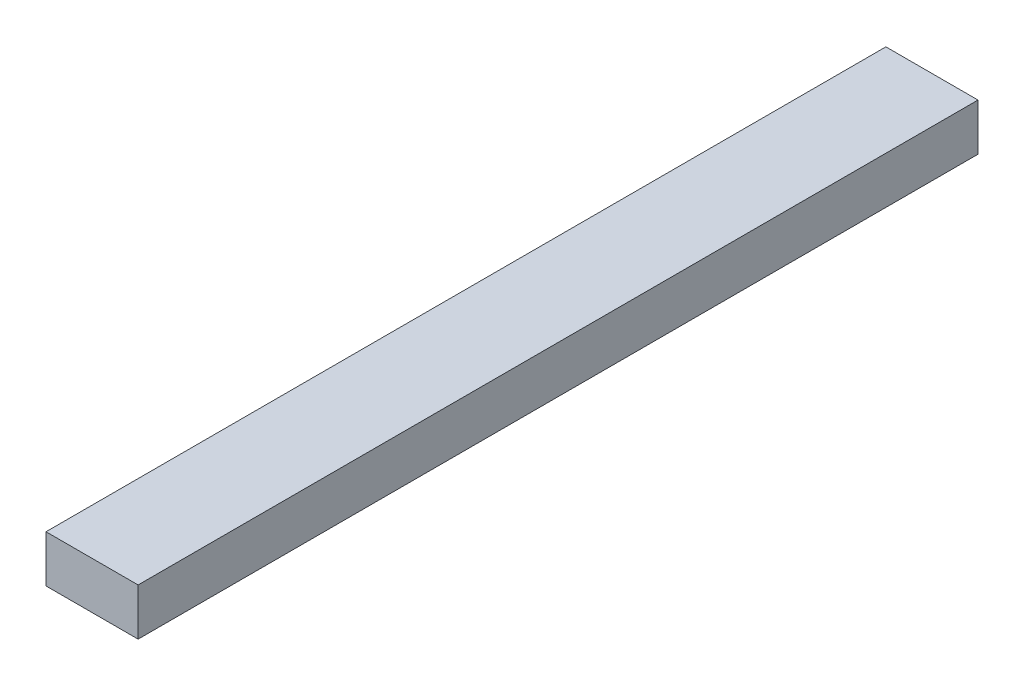
ISO-10303-21;
HEADER;
FILE_DESCRIPTION(('STEP AP214'),'2;1');
FILE_NAME('part.step','',(''),(''),'','','');
FILE_SCHEMA(('AUTOMOTIVE_DESIGN { 1 0 10303 214 1 1 1 1 }'));
ENDSEC;
DATA;
#1=APPLICATION_CONTEXT('core data for automotive mechanical design processes');
#2=APPLICATION_PROTOCOL_DEFINITION('international standard','automotive_design',2000,#1);
#3=PRODUCT_CONTEXT('',#1,'mechanical');
#4=PRODUCT('Part','Part','',(#3));
#5=PRODUCT_RELATED_PRODUCT_CATEGORY('part','',(#4));
#6=PRODUCT_DEFINITION_FORMATION('','',#4);
#7=PRODUCT_DEFINITION_CONTEXT('part definition',#1,'design');
#8=PRODUCT_DEFINITION('design','',#6,#7);
#9=PRODUCT_DEFINITION_SHAPE('','',#8);
#10=(LENGTH_UNIT() NAMED_UNIT(*) SI_UNIT(.MILLI.,.METRE.));
#11=(NAMED_UNIT(*) PLANE_ANGLE_UNIT() SI_UNIT($,.RADIAN.));
#12=(NAMED_UNIT(*) SI_UNIT($,.STERADIAN.) SOLID_ANGLE_UNIT());
#13=UNCERTAINTY_MEASURE_WITH_UNIT(LENGTH_MEASURE(1.E-05),#10,'distance_accuracy_value','');
#14=(GEOMETRIC_REPRESENTATION_CONTEXT(3) GLOBAL_UNCERTAINTY_ASSIGNED_CONTEXT((#13)) GLOBAL_UNIT_ASSIGNED_CONTEXT((#10,
#11,#12)) REPRESENTATION_CONTEXT('',''));
#15=CARTESIAN_POINT('',(0.,0.,0.));
#16=DIRECTION('',(0.,0.,1.));
#17=DIRECTION('',(1.,0.,0.));
#18=AXIS2_PLACEMENT_3D('',#15,#16,#17);
#19=CARTESIAN_POINT('',(-84.1621804374241,15.9452575941677,-234.95));
#20=DIRECTION('',(1.,0.,0.));
#21=DIRECTION('',(0.,0.,-1.));
#22=AXIS2_PLACEMENT_3D('',#19,#20,#21);
#23=PLANE('',#22);
#24=DIRECTION('',(0.,1.,0.));
#25=VECTOR('',#24,1.);
#26=CARTESIAN_POINT('',(-84.1621804374241,15.9452575941677,0.));
#27=LINE('',#26,#25);
#28=CARTESIAN_POINT('',(-84.1621804374241,15.9452575941677,0.));
#29=VERTEX_POINT('',#28);
#30=CARTESIAN_POINT('',(-84.1621804374241,19.2472575941677,0.));
#31=VERTEX_POINT('',#30);
#32=EDGE_CURVE('E58',#29,#31,#27,.T.);
#33=ORIENTED_EDGE('',*,*,#32,.F.);
#34=DIRECTION('',(0.,0.,1.));
#35=VECTOR('',#34,1.);
#36=CARTESIAN_POINT('',(-84.1621804374241,15.9452575941677,-234.95));
#37=LINE('',#36,#35);
#38=CARTESIAN_POINT('',(-84.1621804374241,15.9452575941677,-59.055));
#39=VERTEX_POINT('',#38);
#40=EDGE_CURVE('E33',#39,#29,#37,.T.);
#41=ORIENTED_EDGE('',*,*,#40,.F.);
#42=DIRECTION('',(0.,1.,0.));
#43=VECTOR('',#42,1.);
#44=CARTESIAN_POINT('',(-84.1621804374241,15.9452575941677,-59.055));
#45=LINE('',#44,#43);
#46=CARTESIAN_POINT('',(-84.1621804374241,19.2472575941677,-59.055));
#47=VERTEX_POINT('',#46);
#48=EDGE_CURVE('E60',#39,#47,#45,.T.);
#49=ORIENTED_EDGE('',*,*,#48,.T.);
#50=DIRECTION('',(0.,0.,1.));
#51=VECTOR('',#50,1.);
#52=CARTESIAN_POINT('',(-84.1621804374241,19.2472575941677,-234.95));
#53=LINE('',#52,#51);
#54=EDGE_CURVE('E10',#47,#31,#53,.T.);
#55=ORIENTED_EDGE('',*,*,#54,.T.);
#56=EDGE_LOOP('',(#33,#41,#49,#55));
#57=FACE_BOUND('',#56,.T.);
#58=ADVANCED_FACE('F16',(#57),#23,.T.);
#59=CARTESIAN_POINT('',(-84.1621804374241,19.2472575941677,-234.95));
#60=DIRECTION('',(0.,1.,0.));
#61=DIRECTION('',(0.,0.,1.));
#62=AXIS2_PLACEMENT_3D('',#59,#60,#61);
#63=PLANE('',#62);
#64=DIRECTION('',(-1.,0.,0.));
#65=VECTOR('',#64,1.);
#66=CARTESIAN_POINT('',(-84.1621804374241,19.2472575941677,0.));
#67=LINE('',#66,#65);
#68=CARTESIAN_POINT('',(-90.6391804374241,19.2472575941677,0.));
#69=VERTEX_POINT('',#68);
#70=EDGE_CURVE('E65',#31,#69,#67,.T.);
#71=ORIENTED_EDGE('',*,*,#70,.F.);
#72=ORIENTED_EDGE('',*,*,#54,.F.);
#73=DIRECTION('',(-1.,0.,0.));
#74=VECTOR('',#73,1.);
#75=CARTESIAN_POINT('',(-84.1621804374241,19.2472575941677,-59.055));
#76=LINE('',#75,#74);
#77=CARTESIAN_POINT('',(-90.6391804374241,19.2472575941677,-59.055));
#78=VERTEX_POINT('',#77);
#79=EDGE_CURVE('E87',#47,#78,#76,.T.);
#80=ORIENTED_EDGE('',*,*,#79,.T.);
#81=DIRECTION('',(0.,0.,1.));
#82=VECTOR('',#81,1.);
#83=CARTESIAN_POINT('',(-90.6391804374241,19.2472575941677,-234.95));
#84=LINE('',#83,#82);
#85=EDGE_CURVE('E25',#78,#69,#84,.T.);
#86=ORIENTED_EDGE('',*,*,#85,.T.);
#87=EDGE_LOOP('',(#71,#72,#80,#86));
#88=FACE_BOUND('',#87,.T.);
#89=ADVANCED_FACE('F66',(#88),#63,.T.);
#90=CARTESIAN_POINT('',(-90.6391804374241,19.2472575941677,-234.95));
#91=DIRECTION('',(-1.,0.,0.));
#92=DIRECTION('',(0.,0.,1.));
#93=AXIS2_PLACEMENT_3D('',#90,#91,#92);
#94=PLANE('',#93);
#95=DIRECTION('',(0.,-1.,0.));
#96=VECTOR('',#95,1.);
#97=CARTESIAN_POINT('',(-90.6391804374241,19.2472575941677,0.));
#98=LINE('',#97,#96);
#99=CARTESIAN_POINT('',(-90.6391804374241,15.9452575941677,0.));
#100=VERTEX_POINT('',#99);
#101=EDGE_CURVE('E71',#69,#100,#98,.T.);
#102=ORIENTED_EDGE('',*,*,#101,.F.);
#103=ORIENTED_EDGE('',*,*,#85,.F.);
#104=DIRECTION('',(0.,-1.,0.));
#105=VECTOR('',#104,1.);
#106=CARTESIAN_POINT('',(-90.6391804374241,19.2472575941677,-59.055));
#107=LINE('',#106,#105);
#108=CARTESIAN_POINT('',(-90.6391804374241,15.9452575941677,-59.055));
#109=VERTEX_POINT('',#108);
#110=EDGE_CURVE('E88',#78,#109,#107,.T.);
#111=ORIENTED_EDGE('',*,*,#110,.T.);
#112=DIRECTION('',(0.,0.,1.));
#113=VECTOR('',#112,1.);
#114=CARTESIAN_POINT('',(-90.6391804374241,15.9452575941677,-234.95));
#115=LINE('',#114,#113);
#116=EDGE_CURVE('E40',#109,#100,#115,.T.);
#117=ORIENTED_EDGE('',*,*,#116,.T.);
#118=EDGE_LOOP('',(#102,#103,#111,#117));
#119=FACE_BOUND('',#118,.T.);
#120=ADVANCED_FACE('F101',(#119),#94,.T.);
#121=CARTESIAN_POINT('',(-90.6391804374241,15.9452575941677,-234.95));
#122=DIRECTION('',(0.,-1.,0.));
#123=DIRECTION('',(0.,0.,-1.));
#124=AXIS2_PLACEMENT_3D('',#121,#122,#123);
#125=PLANE('',#124);
#126=DIRECTION('',(1.,0.,0.));
#127=VECTOR('',#126,1.);
#128=CARTESIAN_POINT('',(-90.6391804374241,15.9452575941677,0.));
#129=LINE('',#128,#127);
#130=EDGE_CURVE('E75',#100,#29,#129,.T.);
#131=ORIENTED_EDGE('',*,*,#130,.F.);
#132=ORIENTED_EDGE('',*,*,#116,.F.);
#133=DIRECTION('',(1.,0.,0.));
#134=VECTOR('',#133,1.);
#135=CARTESIAN_POINT('',(-90.6391804374241,15.9452575941677,-59.055));
#136=LINE('',#135,#134);
#137=EDGE_CURVE('E20',#109,#39,#136,.T.);
#138=ORIENTED_EDGE('',*,*,#137,.T.);
#139=ORIENTED_EDGE('',*,*,#40,.T.);
#140=EDGE_LOOP('',(#131,#132,#138,#139));
#141=FACE_BOUND('',#140,.T.);
#142=ADVANCED_FACE('F92',(#141),#125,.T.);
#143=CARTESIAN_POINT('',(0.,0.,-59.055));
#144=DIRECTION('',(0.,0.,1.));
#145=DIRECTION('',(1.,0.,0.));
#146=AXIS2_PLACEMENT_3D('',#143,#144,#145);
#147=PLANE('',#146);
#148=ORIENTED_EDGE('',*,*,#48,.F.);
#149=ORIENTED_EDGE('',*,*,#137,.F.);
#150=ORIENTED_EDGE('',*,*,#110,.F.);
#151=ORIENTED_EDGE('',*,*,#79,.F.);
#152=EDGE_LOOP('',(#148,#149,#150,#151));
#153=FACE_BOUND('',#152,.T.);
#154=ADVANCED_FACE('F18',(#153),#147,.F.);
#155=CARTESIAN_POINT('',(0.,0.,0.));
#156=DIRECTION('',(0.,0.,1.));
#157=DIRECTION('',(1.,0.,0.));
#158=AXIS2_PLACEMENT_3D('',#155,#156,#157);
#159=PLANE('',#158);
#160=ORIENTED_EDGE('',*,*,#32,.T.);
#161=ORIENTED_EDGE('',*,*,#70,.T.);
#162=ORIENTED_EDGE('',*,*,#101,.T.);
#163=ORIENTED_EDGE('',*,*,#130,.T.);
#164=EDGE_LOOP('',(#160,#161,#162,#163));
#165=FACE_BOUND('',#164,.T.);
#166=ADVANCED_FACE('F74',(#165),#159,.T.);
#167=CLOSED_SHELL('',(#58,#89,#120,#142,#154,#166));
#168=MANIFOLD_SOLID_BREP('B1',#167);
#169=ADVANCED_BREP_SHAPE_REPRESENTATION('',(#18,#168),#14);
#170=SHAPE_DEFINITION_REPRESENTATION(#9,#169);
ENDSEC;
END-ISO-10303-21;
